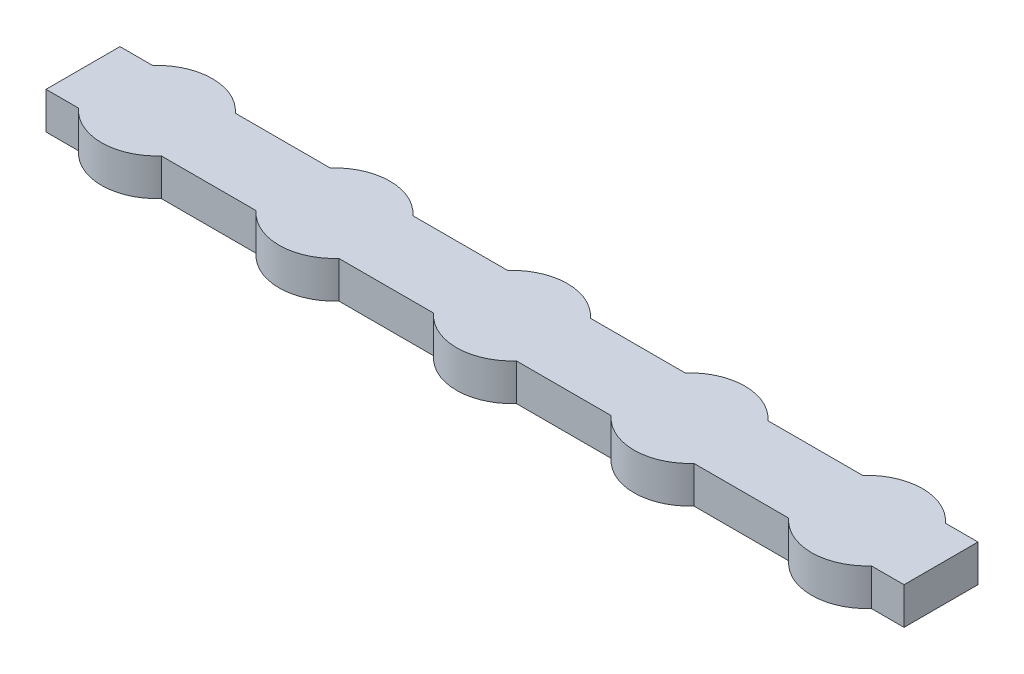
ISO-10303-21;
HEADER;
FILE_DESCRIPTION(('STEP AP214'),'2;1');
FILE_NAME('part.step','',(''),(''),'','','');
FILE_SCHEMA(('AUTOMOTIVE_DESIGN { 1 0 10303 214 1 1 1 1 }'));
ENDSEC;
DATA;
#1=APPLICATION_CONTEXT('core data for automotive mechanical design processes');
#2=APPLICATION_PROTOCOL_DEFINITION('international standard','automotive_design',2000,#1);
#3=PRODUCT_CONTEXT('',#1,'mechanical');
#4=PRODUCT('Part','Part','',(#3));
#5=PRODUCT_RELATED_PRODUCT_CATEGORY('part','',(#4));
#6=PRODUCT_DEFINITION_FORMATION('','',#4);
#7=PRODUCT_DEFINITION_CONTEXT('part definition',#1,'design');
#8=PRODUCT_DEFINITION('design','',#6,#7);
#9=PRODUCT_DEFINITION_SHAPE('','',#8);
#10=(LENGTH_UNIT() NAMED_UNIT(*) SI_UNIT(.MILLI.,.METRE.));
#11=(NAMED_UNIT(*) PLANE_ANGLE_UNIT() SI_UNIT($,.RADIAN.));
#12=(NAMED_UNIT(*) SI_UNIT($,.STERADIAN.) SOLID_ANGLE_UNIT());
#13=UNCERTAINTY_MEASURE_WITH_UNIT(LENGTH_MEASURE(1.E-05),#10,'distance_accuracy_value','');
#14=(GEOMETRIC_REPRESENTATION_CONTEXT(3) GLOBAL_UNCERTAINTY_ASSIGNED_CONTEXT((#13)) GLOBAL_UNIT_ASSIGNED_CONTEXT((#10,
#11,#12)) REPRESENTATION_CONTEXT('',''));
#15=CARTESIAN_POINT('',(0.,0.,0.));
#16=DIRECTION('',(0.,0.,1.));
#17=DIRECTION('',(1.,0.,0.));
#18=AXIS2_PLACEMENT_3D('',#15,#16,#17);
#19=CARTESIAN_POINT('',(0.,0.,10.));
#20=DIRECTION('',(0.,0.,1.));
#21=DIRECTION('',(1.,0.,0.));
#22=AXIS2_PLACEMENT_3D('',#19,#20,#21);
#23=PLANE('',#22);
#24=DIRECTION('',(1.,0.,0.));
#25=VECTOR('',#24,1.);
#26=CARTESIAN_POINT('',(-58.,0.,10.));
#27=LINE('',#26,#25);
#28=CARTESIAN_POINT('',(29.5901699437495,0.,10.));
#29=VERTEX_POINT('',#28);
#30=CARTESIAN_POINT('',(42.4098300562505,0.,10.));
#31=VERTEX_POINT('',#30);
#32=EDGE_CURVE('E63',#29,#31,#27,.T.);
#33=ORIENTED_EDGE('',*,*,#32,.T.);
#34=DIRECTION('',(0.,-1.,0.));
#35=VECTOR('',#34,1.);
#36=CARTESIAN_POINT('',(42.4098300562505,5.,10.));
#37=LINE('',#36,#35);
#38=CARTESIAN_POINT('',(42.4098300562505,4.99999999999999,10.));
#39=VERTEX_POINT('',#38);
#40=EDGE_CURVE('E355',#31,#39,#37,.F.);
#41=ORIENTED_EDGE('',*,*,#40,.T.);
#42=DIRECTION('',(-1.,0.,0.));
#43=VECTOR('',#42,1.);
#44=CARTESIAN_POINT('',(-58.,4.99999999999999,10.));
#45=LINE('',#44,#43);
#46=CARTESIAN_POINT('',(29.5901699437495,4.99999999999999,10.));
#47=VERTEX_POINT('',#46);
#48=EDGE_CURVE('E265',#39,#47,#45,.T.);
#49=ORIENTED_EDGE('',*,*,#48,.T.);
#50=DIRECTION('',(0.,-1.,0.));
#51=VECTOR('',#50,1.);
#52=CARTESIAN_POINT('',(29.5901699437495,5.,10.));
#53=LINE('',#52,#51);
#54=EDGE_CURVE('E340',#47,#29,#53,.T.);
#55=ORIENTED_EDGE('',*,*,#54,.T.);
#56=EDGE_LOOP('',(#33,#41,#49,#55));
#57=FACE_BOUND('',#56,.T.);
#58=ADVANCED_FACE('F39',(#57),#23,.T.);
#59=CARTESIAN_POINT('',(58.,4.99999999999999,10.));
#60=VERTEX_POINT('',#59);
#61=CARTESIAN_POINT('',(53.5901699437495,4.99999999999999,10.));
#62=VERTEX_POINT('',#61);
#63=EDGE_CURVE('E261',#60,#62,#45,.T.);
#64=ORIENTED_EDGE('',*,*,#63,.T.);
#65=DIRECTION('',(0.,-1.,0.));
#66=VECTOR('',#65,1.);
#67=CARTESIAN_POINT('',(53.5901699437495,5.,10.));
#68=LINE('',#67,#66);
#69=CARTESIAN_POINT('',(53.5901699437495,0.,10.));
#70=VERTEX_POINT('',#69);
#71=EDGE_CURVE('E362',#62,#70,#68,.T.);
#72=ORIENTED_EDGE('',*,*,#71,.T.);
#73=CARTESIAN_POINT('',(58.,0.,10.));
#74=VERTEX_POINT('',#73);
#75=EDGE_CURVE('E233',#70,#74,#27,.T.);
#76=ORIENTED_EDGE('',*,*,#75,.T.);
#77=DIRECTION('',(0.,1.,0.));
#78=VECTOR('',#77,1.);
#79=CARTESIAN_POINT('',(58.,4.99999999999999,10.));
#80=LINE('',#79,#78);
#81=EDGE_CURVE('E267',#74,#60,#80,.T.);
#82=ORIENTED_EDGE('',*,*,#81,.T.);
#83=EDGE_LOOP('',(#64,#72,#76,#82));
#84=FACE_BOUND('',#83,.T.);
#85=ADVANCED_FACE('F502',(#84),#23,.T.);
#86=CARTESIAN_POINT('',(0.,0.,0.));
#87=DIRECTION('',(0.,0.,1.));
#88=DIRECTION('',(1.,0.,0.));
#89=AXIS2_PLACEMENT_3D('',#86,#87,#88);
#90=PLANE('',#89);
#91=DIRECTION('',(0.,-1.,0.));
#92=VECTOR('',#91,1.);
#93=CARTESIAN_POINT('',(42.4098300562505,5.,0.));
#94=LINE('',#93,#92);
#95=CARTESIAN_POINT('',(42.4098300562505,0.,0.));
#96=VERTEX_POINT('',#95);
#97=CARTESIAN_POINT('',(42.4098300562505,5.,0.));
#98=VERTEX_POINT('',#97);
#99=EDGE_CURVE('E205',#96,#98,#94,.F.);
#100=ORIENTED_EDGE('',*,*,#99,.F.);
#101=DIRECTION('',(1.,0.,0.));
#102=VECTOR('',#101,1.);
#103=CARTESIAN_POINT('',(-58.,0.,0.));
#104=LINE('',#103,#102);
#105=CARTESIAN_POINT('',(29.5901699437495,0.,0.));
#106=VERTEX_POINT('',#105);
#107=EDGE_CURVE('E380',#106,#96,#104,.T.);
#108=ORIENTED_EDGE('',*,*,#107,.F.);
#109=DIRECTION('',(0.,-1.,0.));
#110=VECTOR('',#109,1.);
#111=CARTESIAN_POINT('',(29.5901699437495,5.,0.));
#112=LINE('',#111,#110);
#113=CARTESIAN_POINT('',(29.5901699437495,5.,0.));
#114=VERTEX_POINT('',#113);
#115=EDGE_CURVE('E346',#114,#106,#112,.T.);
#116=ORIENTED_EDGE('',*,*,#115,.F.);
#117=DIRECTION('',(-1.,0.,0.));
#118=VECTOR('',#117,1.);
#119=CARTESIAN_POINT('',(-58.,4.99999999999999,0.));
#120=LINE('',#119,#118);
#121=EDGE_CURVE('E227',#98,#114,#120,.T.);
#122=ORIENTED_EDGE('',*,*,#121,.F.);
#123=EDGE_LOOP('',(#100,#108,#116,#122));
#124=FACE_BOUND('',#123,.T.);
#125=ADVANCED_FACE('F378',(#124),#90,.F.);
#126=DIRECTION('',(0.,-1.,0.));
#127=VECTOR('',#126,1.);
#128=CARTESIAN_POINT('',(53.5901699437495,5.,0.));
#129=LINE('',#128,#127);
#130=CARTESIAN_POINT('',(53.5901699437495,5.,0.));
#131=VERTEX_POINT('',#130);
#132=CARTESIAN_POINT('',(53.5901699437495,0.,0.));
#133=VERTEX_POINT('',#132);
#134=EDGE_CURVE('E202',#131,#133,#129,.T.);
#135=ORIENTED_EDGE('',*,*,#134,.F.);
#136=CARTESIAN_POINT('',(58.,4.99999999999999,0.));
#137=VERTEX_POINT('',#136);
#138=EDGE_CURVE('E216',#137,#131,#120,.T.);
#139=ORIENTED_EDGE('',*,*,#138,.F.);
#140=DIRECTION('',(0.,1.,0.));
#141=VECTOR('',#140,1.);
#142=CARTESIAN_POINT('',(58.,4.99999999999999,0.));
#143=LINE('',#142,#141);
#144=CARTESIAN_POINT('',(58.,0.,0.));
#145=VERTEX_POINT('',#144);
#146=EDGE_CURVE('E240',#145,#137,#143,.T.);
#147=ORIENTED_EDGE('',*,*,#146,.F.);
#148=EDGE_CURVE('E217',#133,#145,#104,.T.);
#149=ORIENTED_EDGE('',*,*,#148,.F.);
#150=EDGE_LOOP('',(#135,#139,#147,#149));
#151=FACE_BOUND('',#150,.T.);
#152=ADVANCED_FACE('F214',(#151),#90,.F.);
#153=CARTESIAN_POINT('',(5.59016994374951,0.,10.));
#154=VERTEX_POINT('',#153);
#155=CARTESIAN_POINT('',(18.4098300562505,0.,10.));
#156=VERTEX_POINT('',#155);
#157=EDGE_CURVE('E442',#154,#156,#27,.T.);
#158=ORIENTED_EDGE('',*,*,#157,.T.);
#159=DIRECTION('',(0.,-1.,0.));
#160=VECTOR('',#159,1.);
#161=CARTESIAN_POINT('',(18.4098300562505,5.,10.));
#162=LINE('',#161,#160);
#163=CARTESIAN_POINT('',(18.4098300562505,4.99999999999999,10.));
#164=VERTEX_POINT('',#163);
#165=EDGE_CURVE('E333',#156,#164,#162,.F.);
#166=ORIENTED_EDGE('',*,*,#165,.T.);
#167=CARTESIAN_POINT('',(5.59016994374951,4.99999999999999,10.));
#168=VERTEX_POINT('',#167);
#169=EDGE_CURVE('E446',#164,#168,#45,.T.);
#170=ORIENTED_EDGE('',*,*,#169,.T.);
#171=DIRECTION('',(0.,-1.,0.));
#172=VECTOR('',#171,1.);
#173=CARTESIAN_POINT('',(5.59016994374951,5.,10.));
#174=LINE('',#173,#172);
#175=EDGE_CURVE('E316',#168,#154,#174,.T.);
#176=ORIENTED_EDGE('',*,*,#175,.T.);
#177=EDGE_LOOP('',(#158,#166,#170,#176));
#178=FACE_BOUND('',#177,.T.);
#179=ADVANCED_FACE('F492',(#178),#23,.T.);
#180=DIRECTION('',(0.,-1.,0.));
#181=VECTOR('',#180,1.);
#182=CARTESIAN_POINT('',(18.4098300562505,5.,0.));
#183=LINE('',#182,#181);
#184=CARTESIAN_POINT('',(18.4098300562505,0.,0.));
#185=VERTEX_POINT('',#184);
#186=CARTESIAN_POINT('',(18.4098300562505,5.,0.));
#187=VERTEX_POINT('',#186);
#188=EDGE_CURVE('E343',#185,#187,#183,.F.);
#189=ORIENTED_EDGE('',*,*,#188,.F.);
#190=CARTESIAN_POINT('',(5.59016994374946,0.,0.));
#191=VERTEX_POINT('',#190);
#192=EDGE_CURVE('E384',#191,#185,#104,.T.);
#193=ORIENTED_EDGE('',*,*,#192,.F.);
#194=DIRECTION('',(0.,-1.,0.));
#195=VECTOR('',#194,1.);
#196=CARTESIAN_POINT('',(5.59016994374946,5.,0.));
#197=LINE('',#196,#195);
#198=CARTESIAN_POINT('',(5.59016994374946,5.,0.));
#199=VERTEX_POINT('',#198);
#200=EDGE_CURVE('E323',#199,#191,#197,.T.);
#201=ORIENTED_EDGE('',*,*,#200,.F.);
#202=EDGE_CURVE('E235',#187,#199,#120,.T.);
#203=ORIENTED_EDGE('',*,*,#202,.F.);
#204=EDGE_LOOP('',(#189,#193,#201,#203));
#205=FACE_BOUND('',#204,.T.);
#206=ADVANCED_FACE('F489',(#205),#90,.F.);
#207=CARTESIAN_POINT('',(-18.4098300562505,0.,10.));
#208=VERTEX_POINT('',#207);
#209=CARTESIAN_POINT('',(-5.59016994374952,0.,10.));
#210=VERTEX_POINT('',#209);
#211=EDGE_CURVE('E484',#208,#210,#27,.T.);
#212=ORIENTED_EDGE('',*,*,#211,.T.);
#213=DIRECTION('',(0.,-1.,0.));
#214=VECTOR('',#213,1.);
#215=CARTESIAN_POINT('',(-5.59016994374952,5.,10.));
#216=LINE('',#215,#214);
#217=CARTESIAN_POINT('',(-5.59016994374952,4.99999999999999,10.));
#218=VERTEX_POINT('',#217);
#219=EDGE_CURVE('E309',#210,#218,#216,.F.);
#220=ORIENTED_EDGE('',*,*,#219,.T.);
#221=CARTESIAN_POINT('',(-18.4098300562505,4.99999999999999,10.));
#222=VERTEX_POINT('',#221);
#223=EDGE_CURVE('E448',#218,#222,#45,.T.);
#224=ORIENTED_EDGE('',*,*,#223,.T.);
#225=DIRECTION('',(0.,-1.,0.));
#226=VECTOR('',#225,1.);
#227=CARTESIAN_POINT('',(-18.4098300562505,5.,10.));
#228=LINE('',#227,#226);
#229=EDGE_CURVE('E293',#222,#208,#228,.T.);
#230=ORIENTED_EDGE('',*,*,#229,.T.);
#231=EDGE_LOOP('',(#212,#220,#224,#230));
#232=FACE_BOUND('',#231,.T.);
#233=ADVANCED_FACE('F487',(#232),#23,.T.);
#234=DIRECTION('',(0.,-1.,0.));
#235=VECTOR('',#234,1.);
#236=CARTESIAN_POINT('',(-5.59016994374948,5.,0.));
#237=LINE('',#236,#235);
#238=CARTESIAN_POINT('',(-5.59016994374948,0.,0.));
#239=VERTEX_POINT('',#238);
#240=CARTESIAN_POINT('',(-5.59016994374948,5.,0.));
#241=VERTEX_POINT('',#240);
#242=EDGE_CURVE('E320',#239,#241,#237,.F.);
#243=ORIENTED_EDGE('',*,*,#242,.F.);
#244=CARTESIAN_POINT('',(-18.4098300562505,0.,0.));
#245=VERTEX_POINT('',#244);
#246=EDGE_CURVE('E387',#245,#239,#104,.T.);
#247=ORIENTED_EDGE('',*,*,#246,.F.);
#248=DIRECTION('',(0.,-1.,0.));
#249=VECTOR('',#248,1.);
#250=CARTESIAN_POINT('',(-18.4098300562505,5.,0.));
#251=LINE('',#250,#249);
#252=CARTESIAN_POINT('',(-18.4098300562505,5.,0.));
#253=VERTEX_POINT('',#252);
#254=EDGE_CURVE('E300',#253,#245,#251,.T.);
#255=ORIENTED_EDGE('',*,*,#254,.F.);
#256=EDGE_CURVE('E247',#241,#253,#120,.T.);
#257=ORIENTED_EDGE('',*,*,#256,.F.);
#258=EDGE_LOOP('',(#243,#247,#255,#257));
#259=FACE_BOUND('',#258,.T.);
#260=ADVANCED_FACE('F420',(#259),#90,.F.);
#261=CARTESIAN_POINT('',(-42.4098300562505,0.,10.));
#262=VERTEX_POINT('',#261);
#263=CARTESIAN_POINT('',(-29.5901699437495,0.,10.));
#264=VERTEX_POINT('',#263);
#265=EDGE_CURVE('E272',#262,#264,#27,.T.);
#266=ORIENTED_EDGE('',*,*,#265,.T.);
#267=DIRECTION('',(0.,-1.,0.));
#268=VECTOR('',#267,1.);
#269=CARTESIAN_POINT('',(-29.5901699437495,5.,10.));
#270=LINE('',#269,#268);
#271=CARTESIAN_POINT('',(-29.5901699437495,4.99999999999999,10.));
#272=VERTEX_POINT('',#271);
#273=EDGE_CURVE('E286',#264,#272,#270,.F.);
#274=ORIENTED_EDGE('',*,*,#273,.T.);
#275=CARTESIAN_POINT('',(-42.4098300562505,4.99999999999999,10.));
#276=VERTEX_POINT('',#275);
#277=EDGE_CURVE('E453',#272,#276,#45,.T.);
#278=ORIENTED_EDGE('',*,*,#277,.T.);
#279=DIRECTION('',(0.,-1.,0.));
#280=VECTOR('',#279,1.);
#281=CARTESIAN_POINT('',(-42.4098300562505,5.,10.));
#282=LINE('',#281,#280);
#283=EDGE_CURVE('E276',#276,#262,#282,.T.);
#284=ORIENTED_EDGE('',*,*,#283,.T.);
#285=EDGE_LOOP('',(#266,#274,#278,#284));
#286=FACE_BOUND('',#285,.T.);
#287=ADVANCED_FACE('F491',(#286),#23,.T.);
#288=DIRECTION('',(0.,-1.,0.));
#289=VECTOR('',#288,1.);
#290=CARTESIAN_POINT('',(-29.5901699437495,5.,0.));
#291=LINE('',#290,#289);
#292=CARTESIAN_POINT('',(-29.5901699437495,0.,0.));
#293=VERTEX_POINT('',#292);
#294=CARTESIAN_POINT('',(-29.5901699437495,5.,0.));
#295=VERTEX_POINT('',#294);
#296=EDGE_CURVE('E297',#293,#295,#291,.F.);
#297=ORIENTED_EDGE('',*,*,#296,.F.);
#298=CARTESIAN_POINT('',(-42.4098300562505,0.,0.));
#299=VERTEX_POINT('',#298);
#300=EDGE_CURVE('E253',#299,#293,#104,.T.);
#301=ORIENTED_EDGE('',*,*,#300,.F.);
#302=DIRECTION('',(0.,-1.,0.));
#303=VECTOR('',#302,1.);
#304=CARTESIAN_POINT('',(-42.4098300562505,5.,0.));
#305=LINE('',#304,#303);
#306=CARTESIAN_POINT('',(-42.4098300562505,5.,0.));
#307=VERTEX_POINT('',#306);
#308=EDGE_CURVE('E48',#307,#299,#305,.T.);
#309=ORIENTED_EDGE('',*,*,#308,.F.);
#310=EDGE_CURVE('E239',#295,#307,#120,.T.);
#311=ORIENTED_EDGE('',*,*,#310,.F.);
#312=EDGE_LOOP('',(#297,#301,#309,#311));
#313=FACE_BOUND('',#312,.T.);
#314=ADVANCED_FACE('F412',(#313),#90,.F.);
#315=CARTESIAN_POINT('',(-58.,0.,10.));
#316=VERTEX_POINT('',#315);
#317=CARTESIAN_POINT('',(-53.5901699437495,0.,10.));
#318=VERTEX_POINT('',#317);
#319=EDGE_CURVE('E270',#316,#318,#27,.T.);
#320=ORIENTED_EDGE('',*,*,#319,.T.);
#321=DIRECTION('',(0.,-1.,0.));
#322=VECTOR('',#321,1.);
#323=CARTESIAN_POINT('',(-53.5901699437495,5.,10.));
#324=LINE('',#323,#322);
#325=CARTESIAN_POINT('',(-53.5901699437495,4.99999999999999,10.));
#326=VERTEX_POINT('',#325);
#327=EDGE_CURVE('E260',#318,#326,#324,.F.);
#328=ORIENTED_EDGE('',*,*,#327,.T.);
#329=CARTESIAN_POINT('',(-58.,4.99999999999999,10.));
#330=VERTEX_POINT('',#329);
#331=EDGE_CURVE('E266',#326,#330,#45,.T.);
#332=ORIENTED_EDGE('',*,*,#331,.T.);
#333=DIRECTION('',(0.,-1.,0.));
#334=VECTOR('',#333,1.);
#335=CARTESIAN_POINT('',(-58.,4.99999999999999,10.));
#336=LINE('',#335,#334);
#337=EDGE_CURVE('E226',#330,#316,#336,.T.);
#338=ORIENTED_EDGE('',*,*,#337,.T.);
#339=EDGE_LOOP('',(#320,#328,#332,#338));
#340=FACE_BOUND('',#339,.T.);
#341=ADVANCED_FACE('F464',(#340),#23,.T.);
#342=DIRECTION('',(0.,-1.,0.));
#343=VECTOR('',#342,1.);
#344=CARTESIAN_POINT('',(-53.5901699437495,5.,0.));
#345=LINE('',#344,#343);
#346=CARTESIAN_POINT('',(-53.5901699437495,0.,0.));
#347=VERTEX_POINT('',#346);
#348=CARTESIAN_POINT('',(-53.5901699437495,5.,0.));
#349=VERTEX_POINT('',#348);
#350=EDGE_CURVE('E11',#347,#349,#345,.F.);
#351=ORIENTED_EDGE('',*,*,#350,.F.);
#352=CARTESIAN_POINT('',(-58.,0.,0.));
#353=VERTEX_POINT('',#352);
#354=EDGE_CURVE('E248',#353,#347,#104,.T.);
#355=ORIENTED_EDGE('',*,*,#354,.F.);
#356=DIRECTION('',(0.,-1.,0.));
#357=VECTOR('',#356,1.);
#358=CARTESIAN_POINT('',(-58.,4.99999999999999,0.));
#359=LINE('',#358,#357);
#360=CARTESIAN_POINT('',(-58.,4.99999999999999,0.));
#361=VERTEX_POINT('',#360);
#362=EDGE_CURVE('E256',#361,#353,#359,.T.);
#363=ORIENTED_EDGE('',*,*,#362,.F.);
#364=EDGE_CURVE('E229',#349,#361,#120,.T.);
#365=ORIENTED_EDGE('',*,*,#364,.F.);
#366=EDGE_LOOP('',(#351,#355,#363,#365));
#367=FACE_BOUND('',#366,.T.);
#368=ADVANCED_FACE('F509',(#367),#90,.F.);
#369=CARTESIAN_POINT('',(-58.,4.99999999999999,10.));
#370=DIRECTION('',(1.,0.,0.));
#371=DIRECTION('',(0.,0.,-1.));
#372=AXIS2_PLACEMENT_3D('',#369,#370,#371);
#373=PLANE('',#372);
#374=ORIENTED_EDGE('',*,*,#362,.T.);
#375=DIRECTION('',(0.,0.,-1.));
#376=VECTOR('',#375,1.);
#377=CARTESIAN_POINT('',(-58.,0.,10.));
#378=LINE('',#377,#376);
#379=EDGE_CURVE('E393',#316,#353,#378,.T.);
#380=ORIENTED_EDGE('',*,*,#379,.F.);
#381=ORIENTED_EDGE('',*,*,#337,.F.);
#382=DIRECTION('',(0.,0.,-1.));
#383=VECTOR('',#382,1.);
#384=CARTESIAN_POINT('',(-58.,4.99999999999999,10.));
#385=LINE('',#384,#383);
#386=EDGE_CURVE('E264',#330,#361,#385,.T.);
#387=ORIENTED_EDGE('',*,*,#386,.T.);
#388=EDGE_LOOP('',(#374,#380,#381,#387));
#389=FACE_BOUND('',#388,.T.);
#390=ADVANCED_FACE('F41',(#389),#373,.F.);
#391=CARTESIAN_POINT('',(-58.,0.,10.));
#392=DIRECTION('',(0.,1.,0.));
#393=DIRECTION('',(0.,0.,1.));
#394=AXIS2_PLACEMENT_3D('',#391,#392,#393);
#395=PLANE('',#394);
#396=ORIENTED_EDGE('',*,*,#75,.F.);
#397=CARTESIAN_POINT('',(48.,0.,5.00000000000002));
#398=DIRECTION('',(0.,1.,0.));
#399=DIRECTION('',(0.,0.,1.));
#400=AXIS2_PLACEMENT_3D('',#397,#398,#399);
#401=CIRCLE('',#400,7.50000000000002);
#402=EDGE_CURVE('E368',#31,#70,#401,.T.);
#403=ORIENTED_EDGE('',*,*,#402,.F.);
#404=ORIENTED_EDGE('',*,*,#32,.F.);
#405=CARTESIAN_POINT('',(24.,0.,5.00000000000002));
#406=DIRECTION('',(0.,1.,0.));
#407=DIRECTION('',(0.,0.,-1.));
#408=AXIS2_PLACEMENT_3D('',#405,#406,#407);
#409=CIRCLE('',#408,7.50000000000001);
#410=EDGE_CURVE('E354',#156,#29,#409,.T.);
#411=ORIENTED_EDGE('',*,*,#410,.F.);
#412=ORIENTED_EDGE('',*,*,#157,.F.);
#413=CARTESIAN_POINT('',(0.,0.,5.00000000000003));
#414=DIRECTION('',(0.,1.,0.));
#415=DIRECTION('',(0.,0.,1.));
#416=AXIS2_PLACEMENT_3D('',#413,#414,#415);
#417=CIRCLE('',#416,7.50000000000001);
#418=EDGE_CURVE('E328',#210,#154,#417,.T.);
#419=ORIENTED_EDGE('',*,*,#418,.F.);
#420=ORIENTED_EDGE('',*,*,#211,.F.);
#421=CARTESIAN_POINT('',(-24.,0.,5.00000000000003));
#422=DIRECTION('',(0.,1.,0.));
#423=DIRECTION('',(0.,0.,-1.));
#424=AXIS2_PLACEMENT_3D('',#421,#422,#423);
#425=CIRCLE('',#424,7.50000000000001);
#426=EDGE_CURVE('E308',#264,#208,#425,.T.);
#427=ORIENTED_EDGE('',*,*,#426,.F.);
#428=ORIENTED_EDGE('',*,*,#265,.F.);
#429=CARTESIAN_POINT('',(-48.,0.,5.00000000000003));
#430=DIRECTION('',(0.,1.,0.));
#431=DIRECTION('',(0.,0.,1.));
#432=AXIS2_PLACEMENT_3D('',#429,#430,#431);
#433=CIRCLE('',#432,7.50000000000001);
#434=EDGE_CURVE('E281',#318,#262,#433,.T.);
#435=ORIENTED_EDGE('',*,*,#434,.F.);
#436=ORIENTED_EDGE('',*,*,#319,.F.);
#437=ORIENTED_EDGE('',*,*,#379,.T.);
#438=ORIENTED_EDGE('',*,*,#354,.T.);
#439=EDGE_CURVE('E285',#299,#347,#433,.T.);
#440=ORIENTED_EDGE('',*,*,#439,.F.);
#441=ORIENTED_EDGE('',*,*,#300,.T.);
#442=EDGE_CURVE('E305',#245,#293,#425,.T.);
#443=ORIENTED_EDGE('',*,*,#442,.F.);
#444=ORIENTED_EDGE('',*,*,#246,.T.);
#445=EDGE_CURVE('E332',#191,#239,#417,.T.);
#446=ORIENTED_EDGE('',*,*,#445,.F.);
#447=ORIENTED_EDGE('',*,*,#192,.T.);
#448=EDGE_CURVE('E351',#106,#185,#409,.T.);
#449=ORIENTED_EDGE('',*,*,#448,.F.);
#450=ORIENTED_EDGE('',*,*,#107,.T.);
#451=EDGE_CURVE('E55',#133,#96,#401,.T.);
#452=ORIENTED_EDGE('',*,*,#451,.F.);
#453=ORIENTED_EDGE('',*,*,#148,.T.);
#454=DIRECTION('',(0.,0.,-1.));
#455=VECTOR('',#454,1.);
#456=CARTESIAN_POINT('',(58.,0.,10.));
#457=LINE('',#456,#455);
#458=EDGE_CURVE('E389',#74,#145,#457,.T.);
#459=ORIENTED_EDGE('',*,*,#458,.F.);
#460=EDGE_LOOP('',(#396,#403,#404,#411,#412,#419,#420,#427,#428,#435,#436,#437,#438,#440,#441,
#443,#444,#446,#447,#449,#450,#452,#453,#459));
#461=FACE_BOUND('',#460,.T.);
#462=ADVANCED_FACE('F381',(#461),#395,.F.);
#463=CARTESIAN_POINT('',(58.,4.99999999999999,10.));
#464=DIRECTION('',(-1.,0.,0.));
#465=DIRECTION('',(0.,0.,1.));
#466=AXIS2_PLACEMENT_3D('',#463,#464,#465);
#467=PLANE('',#466);
#468=ORIENTED_EDGE('',*,*,#146,.T.);
#469=DIRECTION('',(0.,0.,-1.));
#470=VECTOR('',#469,1.);
#471=CARTESIAN_POINT('',(58.,4.99999999999999,10.));
#472=LINE('',#471,#470);
#473=EDGE_CURVE('E224',#60,#137,#472,.T.);
#474=ORIENTED_EDGE('',*,*,#473,.F.);
#475=ORIENTED_EDGE('',*,*,#81,.F.);
#476=ORIENTED_EDGE('',*,*,#458,.T.);
#477=EDGE_LOOP('',(#468,#474,#475,#476));
#478=FACE_BOUND('',#477,.T.);
#479=ADVANCED_FACE('F391',(#478),#467,.F.);
#480=CARTESIAN_POINT('',(-58.,4.99999999999999,10.));
#481=DIRECTION('',(0.,-1.,0.));
#482=DIRECTION('',(0.,0.,-1.));
#483=AXIS2_PLACEMENT_3D('',#480,#481,#482);
#484=PLANE('',#483);
#485=ORIENTED_EDGE('',*,*,#138,.T.);
#486=CARTESIAN_POINT('',(48.,5.,5.00000000000002));
#487=DIRECTION('',(0.,1.,0.));
#488=DIRECTION('',(0.,0.,1.));
#489=AXIS2_PLACEMENT_3D('',#486,#487,#488);
#490=CIRCLE('',#489,7.50000000000002);
#491=EDGE_CURVE('E199',#131,#98,#490,.T.);
#492=ORIENTED_EDGE('',*,*,#491,.T.);
#493=ORIENTED_EDGE('',*,*,#121,.T.);
#494=CARTESIAN_POINT('',(24.,5.,5.00000000000002));
#495=DIRECTION('',(0.,1.,0.));
#496=DIRECTION('',(0.,0.,-1.));
#497=AXIS2_PLACEMENT_3D('',#494,#495,#496);
#498=CIRCLE('',#497,7.50000000000001);
#499=EDGE_CURVE('E356',#114,#187,#498,.T.);
#500=ORIENTED_EDGE('',*,*,#499,.T.);
#501=ORIENTED_EDGE('',*,*,#202,.T.);
#502=CARTESIAN_POINT('',(0.,5.,5.00000000000003));
#503=DIRECTION('',(0.,1.,0.));
#504=DIRECTION('',(0.,0.,1.));
#505=AXIS2_PLACEMENT_3D('',#502,#503,#504);
#506=CIRCLE('',#505,7.50000000000001);
#507=EDGE_CURVE('E327',#199,#241,#506,.T.);
#508=ORIENTED_EDGE('',*,*,#507,.T.);
#509=ORIENTED_EDGE('',*,*,#256,.T.);
#510=CARTESIAN_POINT('',(-24.,5.,5.00000000000003));
#511=DIRECTION('',(0.,1.,0.));
#512=DIRECTION('',(0.,0.,-1.));
#513=AXIS2_PLACEMENT_3D('',#510,#511,#512);
#514=CIRCLE('',#513,7.50000000000001);
#515=EDGE_CURVE('E310',#253,#295,#514,.T.);
#516=ORIENTED_EDGE('',*,*,#515,.T.);
#517=ORIENTED_EDGE('',*,*,#310,.T.);
#518=CARTESIAN_POINT('',(-48.,5.,5.00000000000003));
#519=DIRECTION('',(0.,1.,0.));
#520=DIRECTION('',(0.,0.,1.));
#521=AXIS2_PLACEMENT_3D('',#518,#519,#520);
#522=CIRCLE('',#521,7.50000000000001);
#523=EDGE_CURVE('E280',#307,#349,#522,.T.);
#524=ORIENTED_EDGE('',*,*,#523,.T.);
#525=ORIENTED_EDGE('',*,*,#364,.T.);
#526=ORIENTED_EDGE('',*,*,#386,.F.);
#527=ORIENTED_EDGE('',*,*,#331,.F.);
#528=EDGE_CURVE('E287',#326,#276,#522,.T.);
#529=ORIENTED_EDGE('',*,*,#528,.T.);
#530=ORIENTED_EDGE('',*,*,#277,.F.);
#531=EDGE_CURVE('E304',#272,#222,#514,.T.);
#532=ORIENTED_EDGE('',*,*,#531,.T.);
#533=ORIENTED_EDGE('',*,*,#223,.F.);
#534=EDGE_CURVE('E334',#218,#168,#506,.T.);
#535=ORIENTED_EDGE('',*,*,#534,.T.);
#536=ORIENTED_EDGE('',*,*,#169,.F.);
#537=EDGE_CURVE('E350',#164,#47,#498,.T.);
#538=ORIENTED_EDGE('',*,*,#537,.T.);
#539=ORIENTED_EDGE('',*,*,#48,.F.);
#540=EDGE_CURVE('E210',#39,#62,#490,.T.);
#541=ORIENTED_EDGE('',*,*,#540,.T.);
#542=ORIENTED_EDGE('',*,*,#63,.F.);
#543=ORIENTED_EDGE('',*,*,#473,.T.);
#544=EDGE_LOOP('',(#485,#492,#493,#500,#501,#508,#509,#516,#517,#524,#525,#526,#527,#529,#530,
#532,#533,#535,#536,#538,#539,#541,#542,#543));
#545=FACE_BOUND('',#544,.T.);
#546=ADVANCED_FACE('F221',(#545),#484,.F.);
#547=CARTESIAN_POINT('',(-48.,5.,5.00000000000003));
#548=DIRECTION('',(0.,-1.,0.));
#549=DIRECTION('',(0.,0.,-1.));
#550=AXIS2_PLACEMENT_3D('',#547,#548,#549);
#551=CYLINDRICAL_SURFACE('',#550,7.50000000000001);
#552=ORIENTED_EDGE('',*,*,#439,.T.);
#553=ORIENTED_EDGE('',*,*,#350,.T.);
#554=ORIENTED_EDGE('',*,*,#523,.F.);
#555=ORIENTED_EDGE('',*,*,#308,.T.);
#556=EDGE_LOOP('',(#552,#553,#554,#555));
#557=FACE_BOUND('',#556,.T.);
#558=ADVANCED_FACE('F406',(#557),#551,.T.);
#559=ORIENTED_EDGE('',*,*,#327,.F.);
#560=ORIENTED_EDGE('',*,*,#434,.T.);
#561=ORIENTED_EDGE('',*,*,#283,.F.);
#562=ORIENTED_EDGE('',*,*,#528,.F.);
#563=EDGE_LOOP('',(#559,#560,#561,#562));
#564=FACE_BOUND('',#563,.T.);
#565=ADVANCED_FACE('F474',(#564),#551,.T.);
#566=CARTESIAN_POINT('',(-24.,5.,5.00000000000003));
#567=DIRECTION('',(0.,-1.,0.));
#568=DIRECTION('',(0.,0.,-1.));
#569=AXIS2_PLACEMENT_3D('',#566,#567,#568);
#570=CYLINDRICAL_SURFACE('',#569,7.50000000000001);
#571=ORIENTED_EDGE('',*,*,#442,.T.);
#572=ORIENTED_EDGE('',*,*,#296,.T.);
#573=ORIENTED_EDGE('',*,*,#515,.F.);
#574=ORIENTED_EDGE('',*,*,#254,.T.);
#575=EDGE_LOOP('',(#571,#572,#573,#574));
#576=FACE_BOUND('',#575,.T.);
#577=ADVANCED_FACE('F564',(#576),#570,.T.);
#578=ORIENTED_EDGE('',*,*,#273,.F.);
#579=ORIENTED_EDGE('',*,*,#426,.T.);
#580=ORIENTED_EDGE('',*,*,#229,.F.);
#581=ORIENTED_EDGE('',*,*,#531,.F.);
#582=EDGE_LOOP('',(#578,#579,#580,#581));
#583=FACE_BOUND('',#582,.T.);
#584=ADVANCED_FACE('F479',(#583),#570,.T.);
#585=CARTESIAN_POINT('',(0.,5.,5.00000000000003));
#586=DIRECTION('',(0.,-1.,0.));
#587=DIRECTION('',(0.,0.,-1.));
#588=AXIS2_PLACEMENT_3D('',#585,#586,#587);
#589=CYLINDRICAL_SURFACE('',#588,7.50000000000001);
#590=ORIENTED_EDGE('',*,*,#445,.T.);
#591=ORIENTED_EDGE('',*,*,#242,.T.);
#592=ORIENTED_EDGE('',*,*,#507,.F.);
#593=ORIENTED_EDGE('',*,*,#200,.T.);
#594=EDGE_LOOP('',(#590,#591,#592,#593));
#595=FACE_BOUND('',#594,.T.);
#596=ADVANCED_FACE('F425',(#595),#589,.T.);
#597=ORIENTED_EDGE('',*,*,#219,.F.);
#598=ORIENTED_EDGE('',*,*,#418,.T.);
#599=ORIENTED_EDGE('',*,*,#175,.F.);
#600=ORIENTED_EDGE('',*,*,#534,.F.);
#601=EDGE_LOOP('',(#597,#598,#599,#600));
#602=FACE_BOUND('',#601,.T.);
#603=ADVANCED_FACE('F588',(#602),#589,.T.);
#604=CARTESIAN_POINT('',(24.,5.,5.00000000000002));
#605=DIRECTION('',(0.,-1.,0.));
#606=DIRECTION('',(0.,0.,-1.));
#607=AXIS2_PLACEMENT_3D('',#604,#605,#606);
#608=CYLINDRICAL_SURFACE('',#607,7.50000000000001);
#609=ORIENTED_EDGE('',*,*,#448,.T.);
#610=ORIENTED_EDGE('',*,*,#188,.T.);
#611=ORIENTED_EDGE('',*,*,#499,.F.);
#612=ORIENTED_EDGE('',*,*,#115,.T.);
#613=EDGE_LOOP('',(#609,#610,#611,#612));
#614=FACE_BOUND('',#613,.T.);
#615=ADVANCED_FACE('F597',(#614),#608,.T.);
#616=ORIENTED_EDGE('',*,*,#165,.F.);
#617=ORIENTED_EDGE('',*,*,#410,.T.);
#618=ORIENTED_EDGE('',*,*,#54,.F.);
#619=ORIENTED_EDGE('',*,*,#537,.F.);
#620=EDGE_LOOP('',(#616,#617,#618,#619));
#621=FACE_BOUND('',#620,.T.);
#622=ADVANCED_FACE('F439',(#621),#608,.T.);
#623=CARTESIAN_POINT('',(48.,5.,5.00000000000002));
#624=DIRECTION('',(0.,-1.,0.));
#625=DIRECTION('',(0.,0.,-1.));
#626=AXIS2_PLACEMENT_3D('',#623,#624,#625);
#627=CYLINDRICAL_SURFACE('',#626,7.50000000000002);
#628=ORIENTED_EDGE('',*,*,#451,.T.);
#629=ORIENTED_EDGE('',*,*,#99,.T.);
#630=ORIENTED_EDGE('',*,*,#491,.F.);
#631=ORIENTED_EDGE('',*,*,#134,.T.);
#632=EDGE_LOOP('',(#628,#629,#630,#631));
#633=FACE_BOUND('',#632,.T.);
#634=ADVANCED_FACE('F201',(#633),#627,.T.);
#635=ORIENTED_EDGE('',*,*,#40,.F.);
#636=ORIENTED_EDGE('',*,*,#402,.T.);
#637=ORIENTED_EDGE('',*,*,#71,.F.);
#638=ORIENTED_EDGE('',*,*,#540,.F.);
#639=EDGE_LOOP('',(#635,#636,#637,#638));
#640=FACE_BOUND('',#639,.T.);
#641=ADVANCED_FACE('F622',(#640),#627,.T.);
#642=CLOSED_SHELL('',(#58,#85,#125,#152,#179,#206,#233,#260,#287,#314,#341,#368,#390,#462,#479,
#546,#558,#565,#577,#584,#596,#603,#615,#622,#634,#641));
#643=MANIFOLD_SOLID_BREP('B2',#642);
#644=ADVANCED_BREP_SHAPE_REPRESENTATION('',(#18,#643),#14);
#645=SHAPE_DEFINITION_REPRESENTATION(#9,#644);
ENDSEC;
END-ISO-10303-21;
